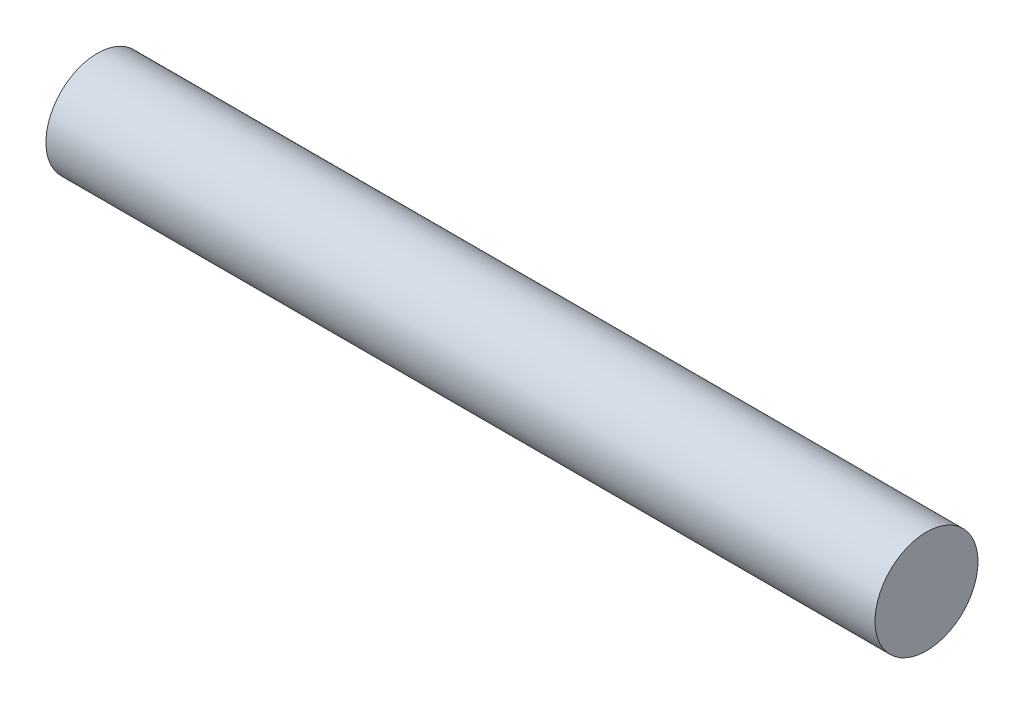
ISO-10303-21;
HEADER;
FILE_DESCRIPTION(('STEP AP214'),'2;1');
FILE_NAME('part.step','',(''),(''),'','','');
FILE_SCHEMA(('AUTOMOTIVE_DESIGN { 1 0 10303 214 1 1 1 1 }'));
ENDSEC;
DATA;
#1=APPLICATION_CONTEXT('core data for automotive mechanical design processes');
#2=APPLICATION_PROTOCOL_DEFINITION('international standard','automotive_design',2000,#1);
#3=PRODUCT_CONTEXT('',#1,'mechanical');
#4=PRODUCT('Part','Part','',(#3));
#5=PRODUCT_RELATED_PRODUCT_CATEGORY('part','',(#4));
#6=PRODUCT_DEFINITION_FORMATION('','',#4);
#7=PRODUCT_DEFINITION_CONTEXT('part definition',#1,'design');
#8=PRODUCT_DEFINITION('design','',#6,#7);
#9=PRODUCT_DEFINITION_SHAPE('','',#8);
#10=(LENGTH_UNIT() NAMED_UNIT(*) SI_UNIT(.MILLI.,.METRE.));
#11=(NAMED_UNIT(*) PLANE_ANGLE_UNIT() SI_UNIT($,.RADIAN.));
#12=(NAMED_UNIT(*) SI_UNIT($,.STERADIAN.) SOLID_ANGLE_UNIT());
#13=UNCERTAINTY_MEASURE_WITH_UNIT(LENGTH_MEASURE(1.E-05),#10,'distance_accuracy_value','');
#14=(GEOMETRIC_REPRESENTATION_CONTEXT(3) GLOBAL_UNCERTAINTY_ASSIGNED_CONTEXT((#13)) GLOBAL_UNIT_ASSIGNED_CONTEXT((#10,
#11,#12)) REPRESENTATION_CONTEXT('',''));
#15=CARTESIAN_POINT('',(0.,0.,0.));
#16=DIRECTION('',(0.,0.,1.));
#17=DIRECTION('',(1.,0.,0.));
#18=AXIS2_PLACEMENT_3D('',#15,#16,#17);
#19=CARTESIAN_POINT('',(1644.142,0.,0.));
#20=DIRECTION('',(-1.,0.,0.));
#21=DIRECTION('',(0.,0.,1.));
#22=AXIS2_PLACEMENT_3D('',#19,#20,#21);
#23=CYLINDRICAL_SURFACE('',#22,102.108);
#24=CARTESIAN_POINT('',(1644.142,0.,0.));
#25=DIRECTION('',(1.,0.,0.));
#26=DIRECTION('',(0.,0.,-1.));
#27=AXIS2_PLACEMENT_3D('',#24,#25,#26);
#28=CIRCLE('',#27,102.108);
#29=CARTESIAN_POINT('',(1644.142,0.,-102.108));
#30=VERTEX_POINT('',#29);
#31=EDGE_CURVE('E10',#30,#30,#28,.T.);
#32=ORIENTED_EDGE('',*,*,#31,.F.);
#33=EDGE_LOOP('',(#32));
#34=FACE_BOUND('',#33,.T.);
#35=CARTESIAN_POINT('',(0.,0.,0.));
#36=DIRECTION('',(1.,0.,0.));
#37=DIRECTION('',(0.,0.,-1.));
#38=AXIS2_PLACEMENT_3D('',#35,#36,#37);
#39=CIRCLE('',#38,102.108);
#40=CARTESIAN_POINT('',(0.,0.,-102.108));
#41=VERTEX_POINT('',#40);
#42=EDGE_CURVE('E34',#41,#41,#39,.T.);
#43=ORIENTED_EDGE('',*,*,#42,.T.);
#44=EDGE_LOOP('',(#43));
#45=FACE_BOUND('',#44,.T.);
#46=ADVANCED_FACE('F31',(#34,#45),#23,.T.);
#47=CARTESIAN_POINT('',(1644.142,0.,0.));
#48=DIRECTION('',(1.,0.,0.));
#49=DIRECTION('',(0.,0.,-1.));
#50=AXIS2_PLACEMENT_3D('',#47,#48,#49);
#51=PLANE('',#50);
#52=ORIENTED_EDGE('',*,*,#31,.T.);
#53=EDGE_LOOP('',(#52));
#54=FACE_BOUND('',#53,.T.);
#55=ADVANCED_FACE('F46',(#54),#51,.T.);
#56=CARTESIAN_POINT('',(0.,0.,0.));
#57=DIRECTION('',(1.,0.,0.));
#58=DIRECTION('',(0.,0.,-1.));
#59=AXIS2_PLACEMENT_3D('',#56,#57,#58);
#60=PLANE('',#59);
#61=ORIENTED_EDGE('',*,*,#42,.F.);
#62=EDGE_LOOP('',(#61));
#63=FACE_BOUND('',#62,.T.);
#64=ADVANCED_FACE('F44',(#63),#60,.F.);
#65=CLOSED_SHELL('',(#46,#55,#64));
#66=MANIFOLD_SOLID_BREP('B2',#65);
#67=ADVANCED_BREP_SHAPE_REPRESENTATION('',(#18,#66),#14);
#68=SHAPE_DEFINITION_REPRESENTATION(#9,#67);
ENDSEC;
END-ISO-10303-21;
